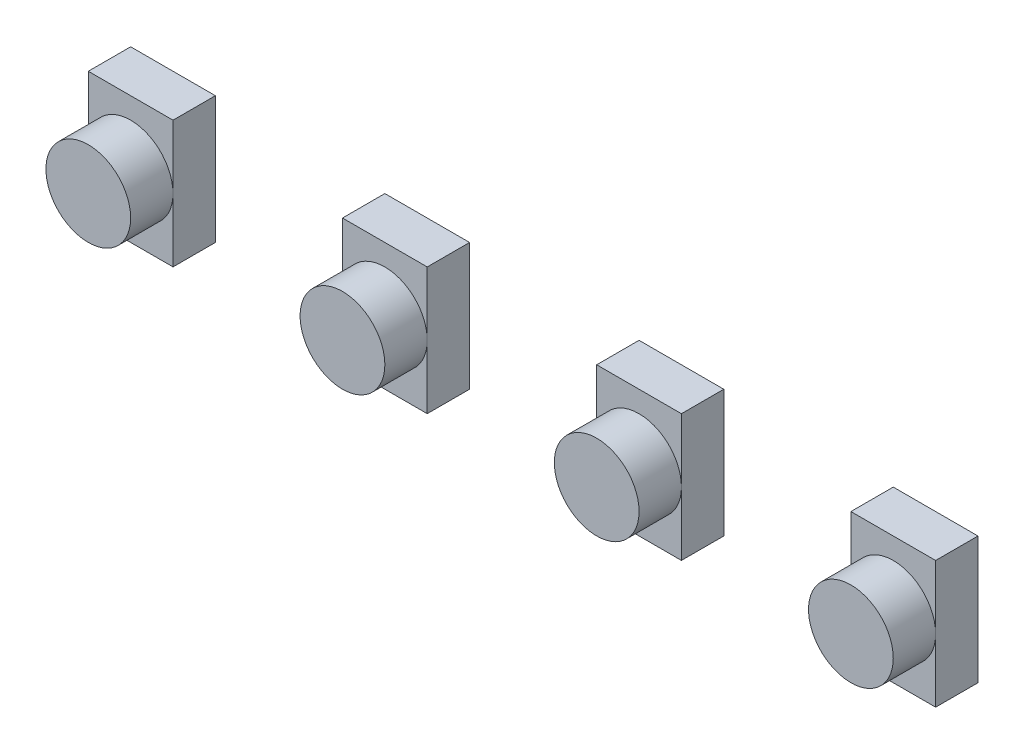
ISO-10303-21;
HEADER;
FILE_DESCRIPTION(('STEP AP214'),'2;1');
FILE_NAME('part.step','',(''),(''),'','','');
FILE_SCHEMA(('AUTOMOTIVE_DESIGN { 1 0 10303 214 1 1 1 1 }'));
ENDSEC;
DATA;
#1=APPLICATION_CONTEXT('core data for automotive mechanical design processes');
#2=APPLICATION_PROTOCOL_DEFINITION('international standard','automotive_design',2000,#1);
#3=PRODUCT_CONTEXT('',#1,'mechanical');
#4=PRODUCT('Part','Part','',(#3));
#5=PRODUCT_RELATED_PRODUCT_CATEGORY('part','',(#4));
#6=PRODUCT_DEFINITION_FORMATION('','',#4);
#7=PRODUCT_DEFINITION_CONTEXT('part definition',#1,'design');
#8=PRODUCT_DEFINITION('design','',#6,#7);
#9=PRODUCT_DEFINITION_SHAPE('','',#8);
#10=(LENGTH_UNIT() NAMED_UNIT(*) SI_UNIT(.MILLI.,.METRE.));
#11=(NAMED_UNIT(*) PLANE_ANGLE_UNIT() SI_UNIT($,.RADIAN.));
#12=(NAMED_UNIT(*) SI_UNIT($,.STERADIAN.) SOLID_ANGLE_UNIT());
#13=UNCERTAINTY_MEASURE_WITH_UNIT(LENGTH_MEASURE(1.E-05),#10,'distance_accuracy_value','');
#14=(GEOMETRIC_REPRESENTATION_CONTEXT(3) GLOBAL_UNCERTAINTY_ASSIGNED_CONTEXT((#13)) GLOBAL_UNIT_ASSIGNED_CONTEXT((#10,
#11,#12)) REPRESENTATION_CONTEXT('',''));
#15=CARTESIAN_POINT('',(0.,0.,0.));
#16=DIRECTION('',(0.,0.,1.));
#17=DIRECTION('',(1.,0.,0.));
#18=AXIS2_PLACEMENT_3D('',#15,#16,#17);
#19=CARTESIAN_POINT('',(146.467654293716,31.7853583065612,10.));
#20=DIRECTION('',(0.,0.,-1.));
#21=DIRECTION('',(-1.,0.,0.));
#22=AXIS2_PLACEMENT_3D('',#19,#20,#21);
#23=CYLINDRICAL_SURFACE('',#22,5.00000000000002);
#24=CARTESIAN_POINT('',(146.467654293716,31.7853583065612,10.));
#25=DIRECTION('',(0.,0.,1.));
#26=DIRECTION('',(1.,0.,0.));
#27=AXIS2_PLACEMENT_3D('',#24,#25,#26);
#28=CIRCLE('',#27,5.00000000000002);
#29=CARTESIAN_POINT('',(151.467654293716,31.7853583065612,10.));
#30=VERTEX_POINT('',#29);
#31=EDGE_CURVE('E52',#30,#30,#28,.T.);
#32=ORIENTED_EDGE('',*,*,#31,.F.);
#33=EDGE_LOOP('',(#32));
#34=FACE_BOUND('',#33,.T.);
#35=CARTESIAN_POINT('',(146.467654293716,31.7853583065612,5.));
#36=DIRECTION('',(0.,0.,1.));
#37=DIRECTION('',(1.,0.,0.));
#38=AXIS2_PLACEMENT_3D('',#35,#36,#37);
#39=CIRCLE('',#38,5.00000000000002);
#40=CARTESIAN_POINT('',(151.467654293716,31.7853583065612,5.));
#41=VERTEX_POINT('',#40);
#42=EDGE_CURVE('E11',#41,#41,#39,.T.);
#43=ORIENTED_EDGE('',*,*,#42,.T.);
#44=EDGE_LOOP('',(#43));
#45=FACE_BOUND('',#44,.T.);
#46=ADVANCED_FACE('F48',(#34,#45),#23,.T.);
#47=CARTESIAN_POINT('',(146.467654293716,31.7853583065612,10.));
#48=DIRECTION('',(0.,0.,1.));
#49=DIRECTION('',(1.,0.,0.));
#50=AXIS2_PLACEMENT_3D('',#47,#48,#49);
#51=PLANE('',#50);
#52=ORIENTED_EDGE('',*,*,#31,.T.);
#53=EDGE_LOOP('',(#52));
#54=FACE_BOUND('',#53,.T.);
#55=ADVANCED_FACE('F50',(#54),#51,.T.);
#56=CARTESIAN_POINT('',(146.467654293716,31.7853583065612,5.));
#57=DIRECTION('',(0.,0.,1.));
#58=DIRECTION('',(1.,0.,0.));
#59=AXIS2_PLACEMENT_3D('',#56,#57,#58);
#60=PLANE('',#59);
#61=ORIENTED_EDGE('',*,*,#42,.F.);
#62=EDGE_LOOP('',(#61));
#63=FACE_BOUND('',#62,.T.);
#64=ADVANCED_FACE('F67',(#63),#60,.F.);
#65=CLOSED_SHELL('',(#46,#55,#64));
#66=MANIFOLD_SOLID_BREP('B2',#65);
#67=CARTESIAN_POINT('',(151.467654293716,39.2853583065612,5.));
#68=DIRECTION('',(-1.,0.,0.));
#69=DIRECTION('',(0.,0.,1.));
#70=AXIS2_PLACEMENT_3D('',#67,#68,#69);
#71=PLANE('',#70);
#72=DIRECTION('',(0.,1.,0.));
#73=VECTOR('',#72,1.);
#74=CARTESIAN_POINT('',(151.467654293716,39.2853583065612,0.));
#75=LINE('',#74,#73);
#76=CARTESIAN_POINT('',(151.467654293716,24.2853583065612,0.));
#77=VERTEX_POINT('',#76);
#78=CARTESIAN_POINT('',(151.467654293716,39.2853583065612,0.));
#79=VERTEX_POINT('',#78);
#80=EDGE_CURVE('E46',#77,#79,#75,.T.);
#81=ORIENTED_EDGE('',*,*,#80,.T.);
#82=DIRECTION('',(0.,0.,-1.));
#83=VECTOR('',#82,1.);
#84=CARTESIAN_POINT('',(151.467654293716,39.2853583065612,5.));
#85=LINE('',#84,#83);
#86=CARTESIAN_POINT('',(151.467654293716,39.2853583065612,5.));
#87=VERTEX_POINT('',#86);
#88=EDGE_CURVE('E176',#87,#79,#85,.T.);
#89=ORIENTED_EDGE('',*,*,#88,.F.);
#90=DIRECTION('',(0.,1.,0.));
#91=VECTOR('',#90,1.);
#92=CARTESIAN_POINT('',(151.467654293716,39.2853583065612,5.));
#93=LINE('',#92,#91);
#94=CARTESIAN_POINT('',(151.467654293716,24.2853583065612,5.));
#95=VERTEX_POINT('',#94);
#96=EDGE_CURVE('E109',#95,#87,#93,.T.);
#97=ORIENTED_EDGE('',*,*,#96,.F.);
#98=DIRECTION('',(0.,0.,-1.));
#99=VECTOR('',#98,1.);
#100=CARTESIAN_POINT('',(151.467654293716,24.2853583065612,5.));
#101=LINE('',#100,#99);
#102=EDGE_CURVE('E164',#95,#77,#101,.T.);
#103=ORIENTED_EDGE('',*,*,#102,.T.);
#104=EDGE_LOOP('',(#81,#89,#97,#103));
#105=FACE_BOUND('',#104,.T.);
#106=ADVANCED_FACE('F105',(#105),#71,.F.);
#107=CARTESIAN_POINT('',(141.467654293716,39.2853583065612,5.));
#108=DIRECTION('',(0.,-1.,0.));
#109=DIRECTION('',(0.,0.,-1.));
#110=AXIS2_PLACEMENT_3D('',#107,#108,#109);
#111=PLANE('',#110);
#112=DIRECTION('',(-1.,0.,0.));
#113=VECTOR('',#112,1.);
#114=CARTESIAN_POINT('',(141.467654293716,39.2853583065612,0.));
#115=LINE('',#114,#113);
#116=CARTESIAN_POINT('',(141.467654293716,39.2853583065612,0.));
#117=VERTEX_POINT('',#116);
#118=EDGE_CURVE('E115',#79,#117,#115,.T.);
#119=ORIENTED_EDGE('',*,*,#118,.T.);
#120=DIRECTION('',(0.,0.,-1.));
#121=VECTOR('',#120,1.);
#122=CARTESIAN_POINT('',(141.467654293716,39.2853583065612,5.));
#123=LINE('',#122,#121);
#124=CARTESIAN_POINT('',(141.467654293716,39.2853583065612,5.));
#125=VERTEX_POINT('',#124);
#126=EDGE_CURVE('E160',#125,#117,#123,.T.);
#127=ORIENTED_EDGE('',*,*,#126,.F.);
#128=DIRECTION('',(-1.,0.,0.));
#129=VECTOR('',#128,1.);
#130=CARTESIAN_POINT('',(141.467654293716,39.2853583065612,5.));
#131=LINE('',#130,#129);
#132=EDGE_CURVE('E139',#87,#125,#131,.T.);
#133=ORIENTED_EDGE('',*,*,#132,.F.);
#134=ORIENTED_EDGE('',*,*,#88,.T.);
#135=EDGE_LOOP('',(#119,#127,#133,#134));
#136=FACE_BOUND('',#135,.T.);
#137=ADVANCED_FACE('F179',(#136),#111,.F.);
#138=CARTESIAN_POINT('',(141.467654293716,39.2853583065612,5.));
#139=DIRECTION('',(1.,0.,0.));
#140=DIRECTION('',(0.,0.,-1.));
#141=AXIS2_PLACEMENT_3D('',#138,#139,#140);
#142=PLANE('',#141);
#143=DIRECTION('',(0.,-1.,0.));
#144=VECTOR('',#143,1.);
#145=CARTESIAN_POINT('',(141.467654293716,39.2853583065612,0.));
#146=LINE('',#145,#144);
#147=CARTESIAN_POINT('',(141.467654293716,24.2853583065612,0.));
#148=VERTEX_POINT('',#147);
#149=EDGE_CURVE('E155',#117,#148,#146,.T.);
#150=ORIENTED_EDGE('',*,*,#149,.T.);
#151=DIRECTION('',(0.,0.,-1.));
#152=VECTOR('',#151,1.);
#153=CARTESIAN_POINT('',(141.467654293716,24.2853583065612,5.));
#154=LINE('',#153,#152);
#155=CARTESIAN_POINT('',(141.467654293716,24.2853583065612,5.));
#156=VERTEX_POINT('',#155);
#157=EDGE_CURVE('E158',#156,#148,#154,.T.);
#158=ORIENTED_EDGE('',*,*,#157,.F.);
#159=DIRECTION('',(0.,-1.,0.));
#160=VECTOR('',#159,1.);
#161=CARTESIAN_POINT('',(141.467654293716,39.2853583065612,5.));
#162=LINE('',#161,#160);
#163=EDGE_CURVE('E172',#125,#156,#162,.T.);
#164=ORIENTED_EDGE('',*,*,#163,.F.);
#165=ORIENTED_EDGE('',*,*,#126,.T.);
#166=EDGE_LOOP('',(#150,#158,#164,#165));
#167=FACE_BOUND('',#166,.T.);
#168=ADVANCED_FACE('F156',(#167),#142,.F.);
#169=CARTESIAN_POINT('',(141.467654293716,24.2853583065612,5.));
#170=DIRECTION('',(0.,1.,0.));
#171=DIRECTION('',(0.,0.,1.));
#172=AXIS2_PLACEMENT_3D('',#169,#170,#171);
#173=PLANE('',#172);
#174=DIRECTION('',(1.,0.,0.));
#175=VECTOR('',#174,1.);
#176=CARTESIAN_POINT('',(141.467654293716,24.2853583065612,0.));
#177=LINE('',#176,#175);
#178=EDGE_CURVE('E149',#148,#77,#177,.T.);
#179=ORIENTED_EDGE('',*,*,#178,.T.);
#180=ORIENTED_EDGE('',*,*,#102,.F.);
#181=DIRECTION('',(1.,0.,0.));
#182=VECTOR('',#181,1.);
#183=CARTESIAN_POINT('',(141.467654293716,24.2853583065612,5.));
#184=LINE('',#183,#182);
#185=EDGE_CURVE('E163',#156,#95,#184,.T.);
#186=ORIENTED_EDGE('',*,*,#185,.F.);
#187=ORIENTED_EDGE('',*,*,#157,.T.);
#188=EDGE_LOOP('',(#179,#180,#186,#187));
#189=FACE_BOUND('',#188,.T.);
#190=ADVANCED_FACE('F162',(#189),#173,.F.);
#191=CARTESIAN_POINT('',(0.,0.,5.));
#192=DIRECTION('',(0.,0.,1.));
#193=DIRECTION('',(1.,0.,0.));
#194=AXIS2_PLACEMENT_3D('',#191,#192,#193);
#195=PLANE('',#194);
#196=ORIENTED_EDGE('',*,*,#96,.T.);
#197=ORIENTED_EDGE('',*,*,#132,.T.);
#198=ORIENTED_EDGE('',*,*,#163,.T.);
#199=ORIENTED_EDGE('',*,*,#185,.T.);
#200=EDGE_LOOP('',(#196,#197,#198,#199));
#201=FACE_BOUND('',#200,.T.);
#202=ADVANCED_FACE('F107',(#201),#195,.T.);
#203=CARTESIAN_POINT('',(0.,0.,0.));
#204=DIRECTION('',(0.,0.,1.));
#205=DIRECTION('',(1.,0.,0.));
#206=AXIS2_PLACEMENT_3D('',#203,#204,#205);
#207=PLANE('',#206);
#208=ORIENTED_EDGE('',*,*,#80,.F.);
#209=ORIENTED_EDGE('',*,*,#178,.F.);
#210=ORIENTED_EDGE('',*,*,#149,.F.);
#211=ORIENTED_EDGE('',*,*,#118,.F.);
#212=EDGE_LOOP('',(#208,#209,#210,#211));
#213=FACE_BOUND('',#212,.T.);
#214=ADVANCED_FACE('F166',(#213),#207,.F.);
#215=CLOSED_SHELL('',(#106,#137,#168,#190,#202,#214));
#216=MANIFOLD_SOLID_BREP('B6',#215);
#217=CARTESIAN_POINT('',(0.,0.,5.));
#218=DIRECTION('',(0.,0.,1.));
#219=DIRECTION('',(1.,0.,0.));
#220=AXIS2_PLACEMENT_3D('',#217,#218,#219);
#221=PLANE('',#220);
#222=CARTESIAN_POINT('',(56.4676542937159,31.7853583065612,5.));
#223=DIRECTION('',(0.,0.,1.));
#224=DIRECTION('',(1.,0.,0.));
#225=AXIS2_PLACEMENT_3D('',#222,#223,#224);
#226=CIRCLE('',#225,5.00000000000001);
#227=CARTESIAN_POINT('',(61.4676542937159,31.7853583065612,5.));
#228=VERTEX_POINT('',#227);
#229=CARTESIAN_POINT('',(51.4676542937159,31.7853583065612,5.));
#230=VERTEX_POINT('',#229);
#231=EDGE_CURVE('E262',#228,#230,#226,.T.);
#232=ORIENTED_EDGE('',*,*,#231,.F.);
#233=DIRECTION('',(0.,1.,0.));
#234=VECTOR('',#233,1.);
#235=CARTESIAN_POINT('',(61.4676542937159,39.2853583065612,5.));
#236=LINE('',#235,#234);
#237=CARTESIAN_POINT('',(61.4676542937159,39.2853583065612,5.));
#238=VERTEX_POINT('',#237);
#239=EDGE_CURVE('E296',#228,#238,#236,.T.);
#240=ORIENTED_EDGE('',*,*,#239,.T.);
#241=DIRECTION('',(-1.,0.,0.));
#242=VECTOR('',#241,1.);
#243=CARTESIAN_POINT('',(51.4676542937159,39.2853583065612,5.));
#244=LINE('',#243,#242);
#245=CARTESIAN_POINT('',(51.4676542937159,39.2853583065612,5.));
#246=VERTEX_POINT('',#245);
#247=EDGE_CURVE('E316',#238,#246,#244,.T.);
#248=ORIENTED_EDGE('',*,*,#247,.T.);
#249=DIRECTION('',(0.,-1.,0.));
#250=VECTOR('',#249,1.);
#251=CARTESIAN_POINT('',(51.4676542937159,39.2853583065612,5.));
#252=LINE('',#251,#250);
#253=EDGE_CURVE('E320',#246,#230,#252,.T.);
#254=ORIENTED_EDGE('',*,*,#253,.T.);
#255=EDGE_LOOP('',(#232,#240,#248,#254));
#256=FACE_BOUND('',#255,.T.);
#257=ADVANCED_FACE('F251',(#256),#221,.T.);
#258=CARTESIAN_POINT('',(61.4676542937159,39.2853583065612,5.));
#259=DIRECTION('',(-1.,0.,0.));
#260=DIRECTION('',(0.,0.,1.));
#261=AXIS2_PLACEMENT_3D('',#258,#259,#260);
#262=PLANE('',#261);
#263=DIRECTION('',(0.,1.,0.));
#264=VECTOR('',#263,1.);
#265=CARTESIAN_POINT('',(61.4676542937159,39.2853583065612,0.));
#266=LINE('',#265,#264);
#267=CARTESIAN_POINT('',(61.4676542937159,24.2853583065612,0.));
#268=VERTEX_POINT('',#267);
#269=CARTESIAN_POINT('',(61.4676542937159,39.2853583065612,0.));
#270=VERTEX_POINT('',#269);
#271=EDGE_CURVE('E260',#268,#270,#266,.T.);
#272=ORIENTED_EDGE('',*,*,#271,.T.);
#273=DIRECTION('',(0.,0.,-1.));
#274=VECTOR('',#273,1.);
#275=CARTESIAN_POINT('',(61.4676542937159,39.2853583065612,5.));
#276=LINE('',#275,#274);
#277=EDGE_CURVE('E315',#238,#270,#276,.T.);
#278=ORIENTED_EDGE('',*,*,#277,.F.);
#279=ORIENTED_EDGE('',*,*,#239,.F.);
#280=CARTESIAN_POINT('',(61.4676542937159,24.2853583065612,5.));
#281=VERTEX_POINT('',#280);
#282=EDGE_CURVE('E255',#281,#228,#236,.T.);
#283=ORIENTED_EDGE('',*,*,#282,.F.);
#284=DIRECTION('',(0.,0.,-1.));
#285=VECTOR('',#284,1.);
#286=CARTESIAN_POINT('',(61.4676542937159,24.2853583065612,5.));
#287=LINE('',#286,#285);
#288=EDGE_CURVE('E374',#281,#268,#287,.T.);
#289=ORIENTED_EDGE('',*,*,#288,.T.);
#290=EDGE_LOOP('',(#272,#278,#279,#283,#289));
#291=FACE_BOUND('',#290,.T.);
#292=ADVANCED_FACE('F314',(#291),#262,.F.);
#293=CARTESIAN_POINT('',(51.4676542937159,39.2853583065612,5.));
#294=DIRECTION('',(0.,-1.,0.));
#295=DIRECTION('',(0.,0.,-1.));
#296=AXIS2_PLACEMENT_3D('',#293,#294,#295);
#297=PLANE('',#296);
#298=DIRECTION('',(-1.,0.,0.));
#299=VECTOR('',#298,1.);
#300=CARTESIAN_POINT('',(51.4676542937159,39.2853583065612,0.));
#301=LINE('',#300,#299);
#302=CARTESIAN_POINT('',(51.4676542937159,39.2853583065612,0.));
#303=VERTEX_POINT('',#302);
#304=EDGE_CURVE('E276',#270,#303,#301,.T.);
#305=ORIENTED_EDGE('',*,*,#304,.T.);
#306=DIRECTION('',(0.,0.,-1.));
#307=VECTOR('',#306,1.);
#308=CARTESIAN_POINT('',(51.4676542937159,39.2853583065612,5.));
#309=LINE('',#308,#307);
#310=EDGE_CURVE('E361',#246,#303,#309,.T.);
#311=ORIENTED_EDGE('',*,*,#310,.F.);
#312=ORIENTED_EDGE('',*,*,#247,.F.);
#313=ORIENTED_EDGE('',*,*,#277,.T.);
#314=EDGE_LOOP('',(#305,#311,#312,#313));
#315=FACE_BOUND('',#314,.T.);
#316=ADVANCED_FACE('F340',(#315),#297,.F.);
#317=CARTESIAN_POINT('',(51.4676542937159,39.2853583065612,5.));
#318=DIRECTION('',(1.,0.,0.));
#319=DIRECTION('',(0.,0.,-1.));
#320=AXIS2_PLACEMENT_3D('',#317,#318,#319);
#321=PLANE('',#320);
#322=DIRECTION('',(0.,-1.,0.));
#323=VECTOR('',#322,1.);
#324=CARTESIAN_POINT('',(51.4676542937159,39.2853583065612,0.));
#325=LINE('',#324,#323);
#326=CARTESIAN_POINT('',(51.4676542937159,24.2853583065612,0.));
#327=VERTEX_POINT('',#326);
#328=EDGE_CURVE('E362',#303,#327,#325,.T.);
#329=ORIENTED_EDGE('',*,*,#328,.T.);
#330=DIRECTION('',(0.,0.,-1.));
#331=VECTOR('',#330,1.);
#332=CARTESIAN_POINT('',(51.4676542937159,24.2853583065612,5.));
#333=LINE('',#332,#331);
#334=CARTESIAN_POINT('',(51.4676542937159,24.2853583065612,5.));
#335=VERTEX_POINT('',#334);
#336=EDGE_CURVE('E365',#335,#327,#333,.T.);
#337=ORIENTED_EDGE('',*,*,#336,.F.);
#338=EDGE_CURVE('E373',#230,#335,#252,.T.);
#339=ORIENTED_EDGE('',*,*,#338,.F.);
#340=ORIENTED_EDGE('',*,*,#253,.F.);
#341=ORIENTED_EDGE('',*,*,#310,.T.);
#342=EDGE_LOOP('',(#329,#337,#339,#340,#341));
#343=FACE_BOUND('',#342,.T.);
#344=ADVANCED_FACE('F347',(#343),#321,.F.);
#345=CARTESIAN_POINT('',(51.4676542937159,24.2853583065612,5.));
#346=DIRECTION('',(0.,1.,0.));
#347=DIRECTION('',(0.,0.,1.));
#348=AXIS2_PLACEMENT_3D('',#345,#346,#347);
#349=PLANE('',#348);
#350=DIRECTION('',(1.,0.,0.));
#351=VECTOR('',#350,1.);
#352=CARTESIAN_POINT('',(51.4676542937159,24.2853583065612,0.));
#353=LINE('',#352,#351);
#354=EDGE_CURVE('E304',#327,#268,#353,.T.);
#355=ORIENTED_EDGE('',*,*,#354,.T.);
#356=ORIENTED_EDGE('',*,*,#288,.F.);
#357=DIRECTION('',(1.,0.,0.));
#358=VECTOR('',#357,1.);
#359=CARTESIAN_POINT('',(51.4676542937159,24.2853583065612,5.));
#360=LINE('',#359,#358);
#361=EDGE_CURVE('E310',#335,#281,#360,.T.);
#362=ORIENTED_EDGE('',*,*,#361,.F.);
#363=ORIENTED_EDGE('',*,*,#336,.T.);
#364=EDGE_LOOP('',(#355,#356,#362,#363));
#365=FACE_BOUND('',#364,.T.);
#366=ADVANCED_FACE('F343',(#365),#349,.F.);
#367=EDGE_CURVE('E103',#230,#228,#226,.T.);
#368=ORIENTED_EDGE('',*,*,#367,.F.);
#369=ORIENTED_EDGE('',*,*,#338,.T.);
#370=ORIENTED_EDGE('',*,*,#361,.T.);
#371=ORIENTED_EDGE('',*,*,#282,.T.);
#372=EDGE_LOOP('',(#368,#369,#370,#371));
#373=FACE_BOUND('',#372,.T.);
#374=ADVANCED_FACE('F253',(#373),#221,.T.);
#375=CARTESIAN_POINT('',(0.,0.,0.));
#376=DIRECTION('',(0.,0.,1.));
#377=DIRECTION('',(1.,0.,0.));
#378=AXIS2_PLACEMENT_3D('',#375,#376,#377);
#379=PLANE('',#378);
#380=ORIENTED_EDGE('',*,*,#271,.F.);
#381=ORIENTED_EDGE('',*,*,#354,.F.);
#382=ORIENTED_EDGE('',*,*,#328,.F.);
#383=ORIENTED_EDGE('',*,*,#304,.F.);
#384=EDGE_LOOP('',(#380,#381,#382,#383));
#385=FACE_BOUND('',#384,.T.);
#386=ADVANCED_FACE('F326',(#385),#379,.F.);
#387=CARTESIAN_POINT('',(56.4676542937159,31.7853583065612,10.));
#388=DIRECTION('',(0.,0.,-1.));
#389=DIRECTION('',(-1.,0.,0.));
#390=AXIS2_PLACEMENT_3D('',#387,#388,#389);
#391=CYLINDRICAL_SURFACE('',#390,5.00000000000001);
#392=CARTESIAN_POINT('',(56.4676542937159,31.7853583065612,10.));
#393=DIRECTION('',(0.,0.,1.));
#394=DIRECTION('',(1.,0.,0.));
#395=AXIS2_PLACEMENT_3D('',#392,#393,#394);
#396=CIRCLE('',#395,5.00000000000001);
#397=CARTESIAN_POINT('',(61.4676542937159,31.7853583065612,10.));
#398=VERTEX_POINT('',#397);
#399=EDGE_CURVE('E322',#398,#398,#396,.T.);
#400=ORIENTED_EDGE('',*,*,#399,.F.);
#401=EDGE_LOOP('',(#400));
#402=FACE_BOUND('',#401,.T.);
#403=ORIENTED_EDGE('',*,*,#231,.T.);
#404=ORIENTED_EDGE('',*,*,#367,.T.);
#405=EDGE_LOOP('',(#403,#404));
#406=FACE_BOUND('',#405,.T.);
#407=ADVANCED_FACE('F323',(#402,#406),#391,.T.);
#408=CARTESIAN_POINT('',(56.4676542937159,31.7853583065612,10.));
#409=DIRECTION('',(0.,0.,1.));
#410=DIRECTION('',(1.,0.,0.));
#411=AXIS2_PLACEMENT_3D('',#408,#409,#410);
#412=PLANE('',#411);
#413=ORIENTED_EDGE('',*,*,#399,.T.);
#414=EDGE_LOOP('',(#413));
#415=FACE_BOUND('',#414,.T.);
#416=ADVANCED_FACE('F325',(#415),#412,.T.);
#417=CLOSED_SHELL('',(#257,#292,#316,#344,#366,#374,#386,#407,#416));
#418=MANIFOLD_SOLID_BREP('B40',#417);
#419=CARTESIAN_POINT('',(0.,0.,5.));
#420=DIRECTION('',(0.,0.,1.));
#421=DIRECTION('',(1.,0.,0.));
#422=AXIS2_PLACEMENT_3D('',#419,#420,#421);
#423=PLANE('',#422);
#424=CARTESIAN_POINT('',(86.4676542937159,31.7853583065612,5.));
#425=DIRECTION('',(0.,0.,1.));
#426=DIRECTION('',(1.,0.,0.));
#427=AXIS2_PLACEMENT_3D('',#424,#425,#426);
#428=CIRCLE('',#427,5.00000000000001);
#429=CARTESIAN_POINT('',(91.4676542937159,31.7853583065612,5.));
#430=VERTEX_POINT('',#429);
#431=CARTESIAN_POINT('',(81.4676542937159,31.7853583065612,5.));
#432=VERTEX_POINT('',#431);
#433=EDGE_CURVE('E464',#430,#432,#428,.T.);
#434=ORIENTED_EDGE('',*,*,#433,.F.);
#435=DIRECTION('',(0.,1.,0.));
#436=VECTOR('',#435,1.);
#437=CARTESIAN_POINT('',(91.4676542937159,39.2853583065612,5.));
#438=LINE('',#437,#436);
#439=CARTESIAN_POINT('',(91.4676542937159,39.2853583065612,5.));
#440=VERTEX_POINT('',#439);
#441=EDGE_CURVE('E498',#430,#440,#438,.T.);
#442=ORIENTED_EDGE('',*,*,#441,.T.);
#443=DIRECTION('',(-1.,0.,0.));
#444=VECTOR('',#443,1.);
#445=CARTESIAN_POINT('',(81.4676542937159,39.2853583065612,5.));
#446=LINE('',#445,#444);
#447=CARTESIAN_POINT('',(81.4676542937159,39.2853583065612,5.));
#448=VERTEX_POINT('',#447);
#449=EDGE_CURVE('E518',#440,#448,#446,.T.);
#450=ORIENTED_EDGE('',*,*,#449,.T.);
#451=DIRECTION('',(0.,-1.,0.));
#452=VECTOR('',#451,1.);
#453=CARTESIAN_POINT('',(81.4676542937159,39.2853583065612,5.));
#454=LINE('',#453,#452);
#455=EDGE_CURVE('E522',#448,#432,#454,.T.);
#456=ORIENTED_EDGE('',*,*,#455,.T.);
#457=EDGE_LOOP('',(#434,#442,#450,#456));
#458=FACE_BOUND('',#457,.T.);
#459=ADVANCED_FACE('F453',(#458),#423,.T.);
#460=CARTESIAN_POINT('',(91.4676542937159,39.2853583065612,5.));
#461=DIRECTION('',(-1.,0.,0.));
#462=DIRECTION('',(0.,0.,1.));
#463=AXIS2_PLACEMENT_3D('',#460,#461,#462);
#464=PLANE('',#463);
#465=DIRECTION('',(0.,1.,0.));
#466=VECTOR('',#465,1.);
#467=CARTESIAN_POINT('',(91.4676542937159,39.2853583065612,0.));
#468=LINE('',#467,#466);
#469=CARTESIAN_POINT('',(91.4676542937159,24.2853583065612,0.));
#470=VERTEX_POINT('',#469);
#471=CARTESIAN_POINT('',(91.4676542937159,39.2853583065612,0.));
#472=VERTEX_POINT('',#471);
#473=EDGE_CURVE('E462',#470,#472,#468,.T.);
#474=ORIENTED_EDGE('',*,*,#473,.T.);
#475=DIRECTION('',(0.,0.,-1.));
#476=VECTOR('',#475,1.);
#477=CARTESIAN_POINT('',(91.4676542937159,39.2853583065612,5.));
#478=LINE('',#477,#476);
#479=EDGE_CURVE('E517',#440,#472,#478,.T.);
#480=ORIENTED_EDGE('',*,*,#479,.F.);
#481=ORIENTED_EDGE('',*,*,#441,.F.);
#482=CARTESIAN_POINT('',(91.4676542937159,24.2853583065612,5.));
#483=VERTEX_POINT('',#482);
#484=EDGE_CURVE('E457',#483,#430,#438,.T.);
#485=ORIENTED_EDGE('',*,*,#484,.F.);
#486=DIRECTION('',(0.,0.,-1.));
#487=VECTOR('',#486,1.);
#488=CARTESIAN_POINT('',(91.4676542937159,24.2853583065612,5.));
#489=LINE('',#488,#487);
#490=EDGE_CURVE('E576',#483,#470,#489,.T.);
#491=ORIENTED_EDGE('',*,*,#490,.T.);
#492=EDGE_LOOP('',(#474,#480,#481,#485,#491));
#493=FACE_BOUND('',#492,.T.);
#494=ADVANCED_FACE('F516',(#493),#464,.F.);
#495=CARTESIAN_POINT('',(81.4676542937159,39.2853583065612,5.));
#496=DIRECTION('',(0.,-1.,0.));
#497=DIRECTION('',(0.,0.,-1.));
#498=AXIS2_PLACEMENT_3D('',#495,#496,#497);
#499=PLANE('',#498);
#500=DIRECTION('',(-1.,0.,0.));
#501=VECTOR('',#500,1.);
#502=CARTESIAN_POINT('',(81.4676542937159,39.2853583065612,0.));
#503=LINE('',#502,#501);
#504=CARTESIAN_POINT('',(81.4676542937159,39.2853583065612,0.));
#505=VERTEX_POINT('',#504);
#506=EDGE_CURVE('E478',#472,#505,#503,.T.);
#507=ORIENTED_EDGE('',*,*,#506,.T.);
#508=DIRECTION('',(0.,0.,-1.));
#509=VECTOR('',#508,1.);
#510=CARTESIAN_POINT('',(81.4676542937159,39.2853583065612,5.));
#511=LINE('',#510,#509);
#512=EDGE_CURVE('E563',#448,#505,#511,.T.);
#513=ORIENTED_EDGE('',*,*,#512,.F.);
#514=ORIENTED_EDGE('',*,*,#449,.F.);
#515=ORIENTED_EDGE('',*,*,#479,.T.);
#516=EDGE_LOOP('',(#507,#513,#514,#515));
#517=FACE_BOUND('',#516,.T.);
#518=ADVANCED_FACE('F542',(#517),#499,.F.);
#519=CARTESIAN_POINT('',(81.4676542937159,39.2853583065612,5.));
#520=DIRECTION('',(1.,0.,0.));
#521=DIRECTION('',(0.,0.,-1.));
#522=AXIS2_PLACEMENT_3D('',#519,#520,#521);
#523=PLANE('',#522);
#524=DIRECTION('',(0.,-1.,0.));
#525=VECTOR('',#524,1.);
#526=CARTESIAN_POINT('',(81.4676542937159,39.2853583065612,0.));
#527=LINE('',#526,#525);
#528=CARTESIAN_POINT('',(81.4676542937159,24.2853583065612,0.));
#529=VERTEX_POINT('',#528);
#530=EDGE_CURVE('E564',#505,#529,#527,.T.);
#531=ORIENTED_EDGE('',*,*,#530,.T.);
#532=DIRECTION('',(0.,0.,-1.));
#533=VECTOR('',#532,1.);
#534=CARTESIAN_POINT('',(81.4676542937159,24.2853583065612,5.));
#535=LINE('',#534,#533);
#536=CARTESIAN_POINT('',(81.4676542937159,24.2853583065612,5.));
#537=VERTEX_POINT('',#536);
#538=EDGE_CURVE('E567',#537,#529,#535,.T.);
#539=ORIENTED_EDGE('',*,*,#538,.F.);
#540=EDGE_CURVE('E575',#432,#537,#454,.T.);
#541=ORIENTED_EDGE('',*,*,#540,.F.);
#542=ORIENTED_EDGE('',*,*,#455,.F.);
#543=ORIENTED_EDGE('',*,*,#512,.T.);
#544=EDGE_LOOP('',(#531,#539,#541,#542,#543));
#545=FACE_BOUND('',#544,.T.);
#546=ADVANCED_FACE('F549',(#545),#523,.F.);
#547=CARTESIAN_POINT('',(81.4676542937159,24.2853583065612,5.));
#548=DIRECTION('',(0.,1.,0.));
#549=DIRECTION('',(0.,0.,1.));
#550=AXIS2_PLACEMENT_3D('',#547,#548,#549);
#551=PLANE('',#550);
#552=DIRECTION('',(1.,0.,0.));
#553=VECTOR('',#552,1.);
#554=CARTESIAN_POINT('',(81.4676542937159,24.2853583065612,0.));
#555=LINE('',#554,#553);
#556=EDGE_CURVE('E506',#529,#470,#555,.T.);
#557=ORIENTED_EDGE('',*,*,#556,.T.);
#558=ORIENTED_EDGE('',*,*,#490,.F.);
#559=DIRECTION('',(1.,0.,0.));
#560=VECTOR('',#559,1.);
#561=CARTESIAN_POINT('',(81.4676542937159,24.2853583065612,5.));
#562=LINE('',#561,#560);
#563=EDGE_CURVE('E512',#537,#483,#562,.T.);
#564=ORIENTED_EDGE('',*,*,#563,.F.);
#565=ORIENTED_EDGE('',*,*,#538,.T.);
#566=EDGE_LOOP('',(#557,#558,#564,#565));
#567=FACE_BOUND('',#566,.T.);
#568=ADVANCED_FACE('F545',(#567),#551,.F.);
#569=EDGE_CURVE('E249',#432,#430,#428,.T.);
#570=ORIENTED_EDGE('',*,*,#569,.F.);
#571=ORIENTED_EDGE('',*,*,#540,.T.);
#572=ORIENTED_EDGE('',*,*,#563,.T.);
#573=ORIENTED_EDGE('',*,*,#484,.T.);
#574=EDGE_LOOP('',(#570,#571,#572,#573));
#575=FACE_BOUND('',#574,.T.);
#576=ADVANCED_FACE('F455',(#575),#423,.T.);
#577=CARTESIAN_POINT('',(0.,0.,0.));
#578=DIRECTION('',(0.,0.,1.));
#579=DIRECTION('',(1.,0.,0.));
#580=AXIS2_PLACEMENT_3D('',#577,#578,#579);
#581=PLANE('',#580);
#582=ORIENTED_EDGE('',*,*,#473,.F.);
#583=ORIENTED_EDGE('',*,*,#556,.F.);
#584=ORIENTED_EDGE('',*,*,#530,.F.);
#585=ORIENTED_EDGE('',*,*,#506,.F.);
#586=EDGE_LOOP('',(#582,#583,#584,#585));
#587=FACE_BOUND('',#586,.T.);
#588=ADVANCED_FACE('F528',(#587),#581,.F.);
#589=CARTESIAN_POINT('',(86.4676542937159,31.7853583065612,10.));
#590=DIRECTION('',(0.,0.,-1.));
#591=DIRECTION('',(-1.,0.,0.));
#592=AXIS2_PLACEMENT_3D('',#589,#590,#591);
#593=CYLINDRICAL_SURFACE('',#592,5.00000000000001);
#594=CARTESIAN_POINT('',(86.4676542937159,31.7853583065612,10.));
#595=DIRECTION('',(0.,0.,1.));
#596=DIRECTION('',(1.,0.,0.));
#597=AXIS2_PLACEMENT_3D('',#594,#595,#596);
#598=CIRCLE('',#597,5.00000000000001);
#599=CARTESIAN_POINT('',(91.4676542937159,31.7853583065612,10.));
#600=VERTEX_POINT('',#599);
#601=EDGE_CURVE('E524',#600,#600,#598,.T.);
#602=ORIENTED_EDGE('',*,*,#601,.F.);
#603=EDGE_LOOP('',(#602));
#604=FACE_BOUND('',#603,.T.);
#605=ORIENTED_EDGE('',*,*,#433,.T.);
#606=ORIENTED_EDGE('',*,*,#569,.T.);
#607=EDGE_LOOP('',(#605,#606));
#608=FACE_BOUND('',#607,.T.);
#609=ADVANCED_FACE('F525',(#604,#608),#593,.T.);
#610=CARTESIAN_POINT('',(86.4676542937159,31.7853583065612,10.));
#611=DIRECTION('',(0.,0.,1.));
#612=DIRECTION('',(1.,0.,0.));
#613=AXIS2_PLACEMENT_3D('',#610,#611,#612);
#614=PLANE('',#613);
#615=ORIENTED_EDGE('',*,*,#601,.T.);
#616=EDGE_LOOP('',(#615));
#617=FACE_BOUND('',#616,.T.);
#618=ADVANCED_FACE('F527',(#617),#614,.T.);
#619=CLOSED_SHELL('',(#459,#494,#518,#546,#568,#576,#588,#609,#618));
#620=MANIFOLD_SOLID_BREP('B97',#619);
#621=CARTESIAN_POINT('',(0.,0.,5.));
#622=DIRECTION('',(0.,0.,1.));
#623=DIRECTION('',(1.,0.,0.));
#624=AXIS2_PLACEMENT_3D('',#621,#622,#623);
#625=PLANE('',#624);
#626=CARTESIAN_POINT('',(116.467654293716,31.7853583065612,5.));
#627=DIRECTION('',(0.,0.,1.));
#628=DIRECTION('',(1.,0.,0.));
#629=AXIS2_PLACEMENT_3D('',#626,#627,#628);
#630=CIRCLE('',#629,5.00000000000001);
#631=CARTESIAN_POINT('',(121.467654293716,31.7853583065612,5.));
#632=VERTEX_POINT('',#631);
#633=CARTESIAN_POINT('',(111.467654293716,31.7853583065612,5.));
#634=VERTEX_POINT('',#633);
#635=EDGE_CURVE('E656',#632,#634,#630,.T.);
#636=ORIENTED_EDGE('',*,*,#635,.F.);
#637=DIRECTION('',(0.,1.,0.));
#638=VECTOR('',#637,1.);
#639=CARTESIAN_POINT('',(121.467654293716,39.2853583065612,5.));
#640=LINE('',#639,#638);
#641=CARTESIAN_POINT('',(121.467654293716,39.2853583065612,5.));
#642=VERTEX_POINT('',#641);
#643=EDGE_CURVE('E696',#632,#642,#640,.T.);
#644=ORIENTED_EDGE('',*,*,#643,.T.);
#645=DIRECTION('',(-1.,0.,0.));
#646=VECTOR('',#645,1.);
#647=CARTESIAN_POINT('',(111.467654293716,39.2853583065612,5.));
#648=LINE('',#647,#646);
#649=CARTESIAN_POINT('',(111.467654293716,39.2853583065612,5.));
#650=VERTEX_POINT('',#649);
#651=EDGE_CURVE('E703',#642,#650,#648,.T.);
#652=ORIENTED_EDGE('',*,*,#651,.T.);
#653=DIRECTION('',(0.,-1.,0.));
#654=VECTOR('',#653,1.);
#655=CARTESIAN_POINT('',(111.467654293716,39.2853583065612,5.));
#656=LINE('',#655,#654);
#657=EDGE_CURVE('E711',#650,#634,#656,.T.);
#658=ORIENTED_EDGE('',*,*,#657,.T.);
#659=EDGE_LOOP('',(#636,#644,#652,#658));
#660=FACE_BOUND('',#659,.T.);
#661=ADVANCED_FACE('F646',(#660),#625,.T.);
#662=CARTESIAN_POINT('',(121.467654293716,39.2853583065612,5.));
#663=DIRECTION('',(-1.,0.,0.));
#664=DIRECTION('',(0.,0.,1.));
#665=AXIS2_PLACEMENT_3D('',#662,#663,#664);
#666=PLANE('',#665);
#667=DIRECTION('',(0.,1.,0.));
#668=VECTOR('',#667,1.);
#669=CARTESIAN_POINT('',(121.467654293716,39.2853583065612,0.));
#670=LINE('',#669,#668);
#671=CARTESIAN_POINT('',(121.467654293716,24.2853583065612,0.));
#672=VERTEX_POINT('',#671);
#673=CARTESIAN_POINT('',(121.467654293716,39.2853583065612,0.));
#674=VERTEX_POINT('',#673);
#675=EDGE_CURVE('E758',#672,#674,#670,.T.);
#676=ORIENTED_EDGE('',*,*,#675,.T.);
#677=DIRECTION('',(0.,0.,-1.));
#678=VECTOR('',#677,1.);
#679=CARTESIAN_POINT('',(121.467654293716,39.2853583065612,5.));
#680=LINE('',#679,#678);
#681=EDGE_CURVE('E650',#642,#674,#680,.T.);
#682=ORIENTED_EDGE('',*,*,#681,.F.);
#683=ORIENTED_EDGE('',*,*,#643,.F.);
#684=CARTESIAN_POINT('',(121.467654293716,24.2853583065612,5.));
#685=VERTEX_POINT('',#684);
#686=EDGE_CURVE('E700',#685,#632,#640,.T.);
#687=ORIENTED_EDGE('',*,*,#686,.F.);
#688=DIRECTION('',(0.,0.,-1.));
#689=VECTOR('',#688,1.);
#690=CARTESIAN_POINT('',(121.467654293716,24.2853583065612,5.));
#691=LINE('',#690,#689);
#692=EDGE_CURVE('E766',#685,#672,#691,.T.);
#693=ORIENTED_EDGE('',*,*,#692,.T.);
#694=EDGE_LOOP('',(#676,#682,#683,#687,#693));
#695=FACE_BOUND('',#694,.T.);
#696=ADVANCED_FACE('F648',(#695),#666,.F.);
#697=CARTESIAN_POINT('',(111.467654293716,39.2853583065612,5.));
#698=DIRECTION('',(0.,-1.,0.));
#699=DIRECTION('',(0.,0.,-1.));
#700=AXIS2_PLACEMENT_3D('',#697,#698,#699);
#701=PLANE('',#700);
#702=DIRECTION('',(-1.,0.,0.));
#703=VECTOR('',#702,1.);
#704=CARTESIAN_POINT('',(111.467654293716,39.2853583065612,0.));
#705=LINE('',#704,#703);
#706=CARTESIAN_POINT('',(111.467654293716,39.2853583065612,0.));
#707=VERTEX_POINT('',#706);
#708=EDGE_CURVE('E752',#674,#707,#705,.T.);
#709=ORIENTED_EDGE('',*,*,#708,.T.);
#710=DIRECTION('',(0.,0.,-1.));
#711=VECTOR('',#710,1.);
#712=CARTESIAN_POINT('',(111.467654293716,39.2853583065612,5.));
#713=LINE('',#712,#711);
#714=EDGE_CURVE('E754',#650,#707,#713,.T.);
#715=ORIENTED_EDGE('',*,*,#714,.F.);
#716=ORIENTED_EDGE('',*,*,#651,.F.);
#717=ORIENTED_EDGE('',*,*,#681,.T.);
#718=EDGE_LOOP('',(#709,#715,#716,#717));
#719=FACE_BOUND('',#718,.T.);
#720=ADVANCED_FACE('F734',(#719),#701,.F.);
#721=CARTESIAN_POINT('',(111.467654293716,39.2853583065612,5.));
#722=DIRECTION('',(1.,0.,0.));
#723=DIRECTION('',(0.,0.,-1.));
#724=AXIS2_PLACEMENT_3D('',#721,#722,#723);
#725=PLANE('',#724);
#726=DIRECTION('',(0.,-1.,0.));
#727=VECTOR('',#726,1.);
#728=CARTESIAN_POINT('',(111.467654293716,39.2853583065612,0.));
#729=LINE('',#728,#727);
#730=CARTESIAN_POINT('',(111.467654293716,24.2853583065612,0.));
#731=VERTEX_POINT('',#730);
#732=EDGE_CURVE('E757',#707,#731,#729,.T.);
#733=ORIENTED_EDGE('',*,*,#732,.T.);
#734=DIRECTION('',(0.,0.,-1.));
#735=VECTOR('',#734,1.);
#736=CARTESIAN_POINT('',(111.467654293716,24.2853583065612,5.));
#737=LINE('',#736,#735);
#738=CARTESIAN_POINT('',(111.467654293716,24.2853583065612,5.));
#739=VERTEX_POINT('',#738);
#740=EDGE_CURVE('E761',#739,#731,#737,.T.);
#741=ORIENTED_EDGE('',*,*,#740,.F.);
#742=EDGE_CURVE('E768',#634,#739,#656,.T.);
#743=ORIENTED_EDGE('',*,*,#742,.F.);
#744=ORIENTED_EDGE('',*,*,#657,.F.);
#745=ORIENTED_EDGE('',*,*,#714,.T.);
#746=EDGE_LOOP('',(#733,#741,#743,#744,#745));
#747=FACE_BOUND('',#746,.T.);
#748=ADVANCED_FACE('F740',(#747),#725,.F.);
#749=CARTESIAN_POINT('',(111.467654293716,24.2853583065612,5.));
#750=DIRECTION('',(0.,1.,0.));
#751=DIRECTION('',(0.,0.,1.));
#752=AXIS2_PLACEMENT_3D('',#749,#750,#751);
#753=PLANE('',#752);
#754=DIRECTION('',(1.,0.,0.));
#755=VECTOR('',#754,1.);
#756=CARTESIAN_POINT('',(111.467654293716,24.2853583065612,0.));
#757=LINE('',#756,#755);
#758=EDGE_CURVE('E688',#731,#672,#757,.T.);
#759=ORIENTED_EDGE('',*,*,#758,.T.);
#760=ORIENTED_EDGE('',*,*,#692,.F.);
#761=DIRECTION('',(1.,0.,0.));
#762=VECTOR('',#761,1.);
#763=CARTESIAN_POINT('',(111.467654293716,24.2853583065612,5.));
#764=LINE('',#763,#762);
#765=EDGE_CURVE('E667',#739,#685,#764,.T.);
#766=ORIENTED_EDGE('',*,*,#765,.F.);
#767=ORIENTED_EDGE('',*,*,#740,.T.);
#768=EDGE_LOOP('',(#759,#760,#766,#767));
#769=FACE_BOUND('',#768,.T.);
#770=ADVANCED_FACE('F736',(#769),#753,.F.);
#771=EDGE_CURVE('E451',#634,#632,#630,.T.);
#772=ORIENTED_EDGE('',*,*,#771,.F.);
#773=ORIENTED_EDGE('',*,*,#742,.T.);
#774=ORIENTED_EDGE('',*,*,#765,.T.);
#775=ORIENTED_EDGE('',*,*,#686,.T.);
#776=EDGE_LOOP('',(#772,#773,#774,#775));
#777=FACE_BOUND('',#776,.T.);
#778=ADVANCED_FACE('F701',(#777),#625,.T.);
#779=CARTESIAN_POINT('',(0.,0.,0.));
#780=DIRECTION('',(0.,0.,1.));
#781=DIRECTION('',(1.,0.,0.));
#782=AXIS2_PLACEMENT_3D('',#779,#780,#781);
#783=PLANE('',#782);
#784=ORIENTED_EDGE('',*,*,#675,.F.);
#785=ORIENTED_EDGE('',*,*,#758,.F.);
#786=ORIENTED_EDGE('',*,*,#732,.F.);
#787=ORIENTED_EDGE('',*,*,#708,.F.);
#788=EDGE_LOOP('',(#784,#785,#786,#787));
#789=FACE_BOUND('',#788,.T.);
#790=ADVANCED_FACE('F717',(#789),#783,.F.);
#791=CARTESIAN_POINT('',(116.467654293716,31.7853583065612,10.));
#792=DIRECTION('',(0.,0.,-1.));
#793=DIRECTION('',(-1.,0.,0.));
#794=AXIS2_PLACEMENT_3D('',#791,#792,#793);
#795=CYLINDRICAL_SURFACE('',#794,5.00000000000001);
#796=CARTESIAN_POINT('',(116.467654293716,31.7853583065612,10.));
#797=DIRECTION('',(0.,0.,1.));
#798=DIRECTION('',(1.,0.,0.));
#799=AXIS2_PLACEMENT_3D('',#796,#797,#798);
#800=CIRCLE('',#799,5.00000000000001);
#801=CARTESIAN_POINT('',(121.467654293716,31.7853583065612,10.));
#802=VERTEX_POINT('',#801);
#803=EDGE_CURVE('E713',#802,#802,#800,.T.);
#804=ORIENTED_EDGE('',*,*,#803,.F.);
#805=EDGE_LOOP('',(#804));
#806=FACE_BOUND('',#805,.T.);
#807=ORIENTED_EDGE('',*,*,#635,.T.);
#808=ORIENTED_EDGE('',*,*,#771,.T.);
#809=EDGE_LOOP('',(#807,#808));
#810=FACE_BOUND('',#809,.T.);
#811=ADVANCED_FACE('F714',(#806,#810),#795,.T.);
#812=CARTESIAN_POINT('',(116.467654293716,31.7853583065612,10.));
#813=DIRECTION('',(0.,0.,1.));
#814=DIRECTION('',(1.,0.,0.));
#815=AXIS2_PLACEMENT_3D('',#812,#813,#814);
#816=PLANE('',#815);
#817=ORIENTED_EDGE('',*,*,#803,.T.);
#818=EDGE_LOOP('',(#817));
#819=FACE_BOUND('',#818,.T.);
#820=ADVANCED_FACE('F716',(#819),#816,.T.);
#821=CLOSED_SHELL('',(#661,#696,#720,#748,#770,#778,#790,#811,#820));
#822=MANIFOLD_SOLID_BREP('B243',#821);
#823=ADVANCED_BREP_SHAPE_REPRESENTATION('',(#18,#66,#216,#418,#620,#822),#14);
#824=SHAPE_DEFINITION_REPRESENTATION(#9,#823);
ENDSEC;
END-ISO-10303-21;
